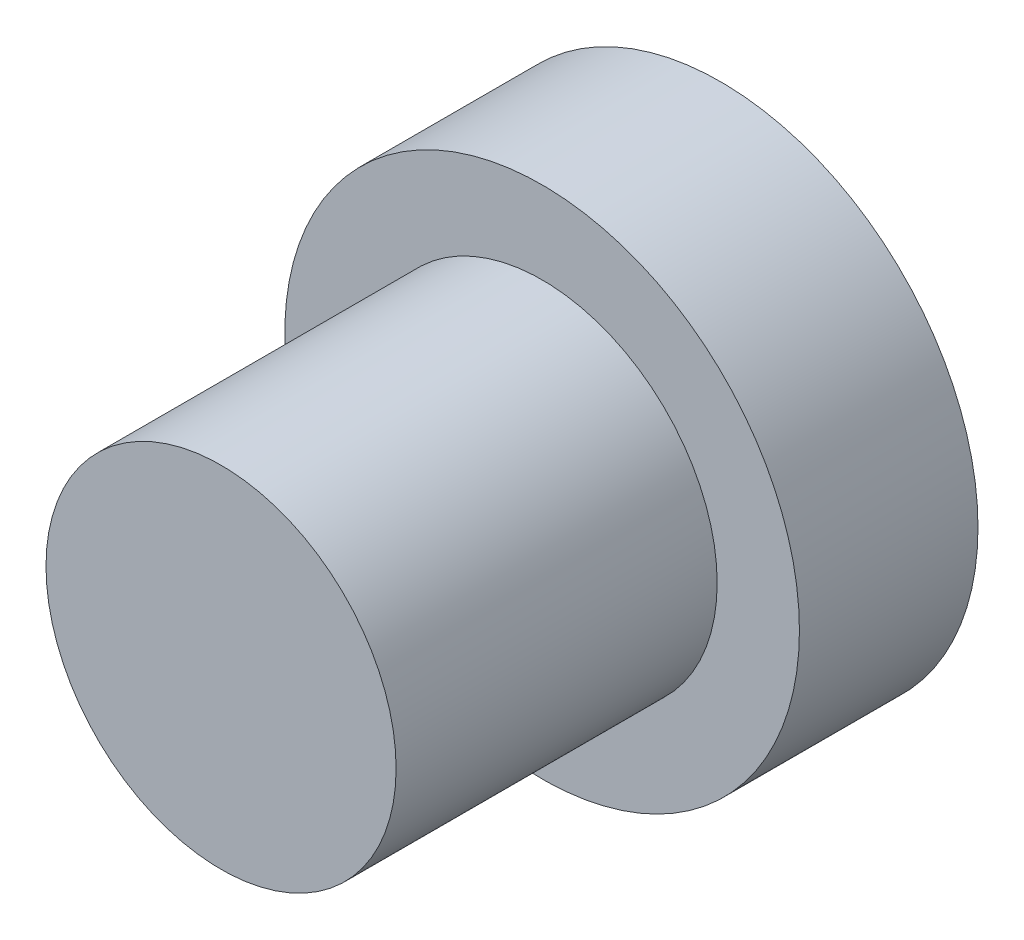
ISO-10303-21;
HEADER;
FILE_DESCRIPTION(('STEP AP214'),'2;1');
FILE_NAME('part.step','',(''),(''),'','','');
FILE_SCHEMA(('AUTOMOTIVE_DESIGN { 1 0 10303 214 1 1 1 1 }'));
ENDSEC;
DATA;
#1=APPLICATION_CONTEXT('core data for automotive mechanical design processes');
#2=APPLICATION_PROTOCOL_DEFINITION('international standard','automotive_design',2000,#1);
#3=PRODUCT_CONTEXT('',#1,'mechanical');
#4=PRODUCT('Part','Part','',(#3));
#5=PRODUCT_RELATED_PRODUCT_CATEGORY('part','',(#4));
#6=PRODUCT_DEFINITION_FORMATION('','',#4);
#7=PRODUCT_DEFINITION_CONTEXT('part definition',#1,'design');
#8=PRODUCT_DEFINITION('design','',#6,#7);
#9=PRODUCT_DEFINITION_SHAPE('','',#8);
#10=(LENGTH_UNIT() NAMED_UNIT(*) SI_UNIT(.MILLI.,.METRE.));
#11=(NAMED_UNIT(*) PLANE_ANGLE_UNIT() SI_UNIT($,.RADIAN.));
#12=(NAMED_UNIT(*) SI_UNIT($,.STERADIAN.) SOLID_ANGLE_UNIT());
#13=UNCERTAINTY_MEASURE_WITH_UNIT(LENGTH_MEASURE(1.E-05),#10,'distance_accuracy_value','');
#14=(GEOMETRIC_REPRESENTATION_CONTEXT(3) GLOBAL_UNCERTAINTY_ASSIGNED_CONTEXT((#13)) GLOBAL_UNIT_ASSIGNED_CONTEXT((#10,
#11,#12)) REPRESENTATION_CONTEXT('',''));
#15=CARTESIAN_POINT('',(0.,0.,0.));
#16=DIRECTION('',(0.,0.,1.));
#17=DIRECTION('',(1.,0.,0.));
#18=AXIS2_PLACEMENT_3D('',#15,#16,#17);
#19=CARTESIAN_POINT('',(0.,0.,5.1));
#20=DIRECTION('',(0.,0.,1.));
#21=DIRECTION('',(1.,0.,0.));
#22=AXIS2_PLACEMENT_3D('',#19,#20,#21);
#23=PLANE('',#22);
#24=CARTESIAN_POINT('',(0.,0.,5.1));
#25=DIRECTION('',(0.,0.,1.));
#26=DIRECTION('',(1.,0.,0.));
#27=AXIS2_PLACEMENT_3D('',#24,#25,#26);
#28=CIRCLE('',#27,7.35);
#29=CARTESIAN_POINT('',(7.35,0.,5.1));
#30=VERTEX_POINT('',#29);
#31=EDGE_CURVE('E10',#30,#30,#28,.T.);
#32=ORIENTED_EDGE('',*,*,#31,.T.);
#33=EDGE_LOOP('',(#32));
#34=FACE_BOUND('',#33,.T.);
#35=CARTESIAN_POINT('',(0.,0.,5.1));
#36=DIRECTION('',(0.,0.,1.));
#37=DIRECTION('',(1.,0.,0.));
#38=AXIS2_PLACEMENT_3D('',#35,#36,#37);
#39=CIRCLE('',#38,5.);
#40=CARTESIAN_POINT('',(5.,0.,5.1));
#41=VERTEX_POINT('',#40);
#42=EDGE_CURVE('E42',#41,#41,#39,.T.);
#43=ORIENTED_EDGE('',*,*,#42,.F.);
#44=EDGE_LOOP('',(#43));
#45=FACE_BOUND('',#44,.T.);
#46=ADVANCED_FACE('F29',(#34,#45),#23,.T.);
#47=CARTESIAN_POINT('',(0.,0.,5.1));
#48=DIRECTION('',(0.,0.,-1.));
#49=DIRECTION('',(-1.,0.,0.));
#50=AXIS2_PLACEMENT_3D('',#47,#48,#49);
#51=CYLINDRICAL_SURFACE('',#50,7.35);
#52=ORIENTED_EDGE('',*,*,#31,.F.);
#53=EDGE_LOOP('',(#52));
#54=FACE_BOUND('',#53,.T.);
#55=CARTESIAN_POINT('',(0.,0.,0.));
#56=DIRECTION('',(0.,0.,1.));
#57=DIRECTION('',(1.,0.,0.));
#58=AXIS2_PLACEMENT_3D('',#55,#56,#57);
#59=CIRCLE('',#58,7.35);
#60=CARTESIAN_POINT('',(7.35,0.,0.));
#61=VERTEX_POINT('',#60);
#62=EDGE_CURVE('E33',#61,#61,#59,.T.);
#63=ORIENTED_EDGE('',*,*,#62,.T.);
#64=EDGE_LOOP('',(#63));
#65=FACE_BOUND('',#64,.T.);
#66=ADVANCED_FACE('F31',(#54,#65),#51,.T.);
#67=CARTESIAN_POINT('',(0.,0.,0.));
#68=DIRECTION('',(0.,0.,1.));
#69=DIRECTION('',(1.,0.,0.));
#70=AXIS2_PLACEMENT_3D('',#67,#68,#69);
#71=PLANE('',#70);
#72=ORIENTED_EDGE('',*,*,#62,.F.);
#73=EDGE_LOOP('',(#72));
#74=FACE_BOUND('',#73,.T.);
#75=ADVANCED_FACE('F53',(#74),#71,.F.);
#76=CARTESIAN_POINT('',(0.,0.,14.27));
#77=DIRECTION('',(0.,0.,-1.));
#78=DIRECTION('',(-1.,0.,0.));
#79=AXIS2_PLACEMENT_3D('',#76,#77,#78);
#80=CYLINDRICAL_SURFACE('',#79,5.);
#81=CARTESIAN_POINT('',(0.,0.,14.27));
#82=DIRECTION('',(0.,0.,1.));
#83=DIRECTION('',(1.,0.,0.));
#84=AXIS2_PLACEMENT_3D('',#81,#82,#83);
#85=CIRCLE('',#84,5.);
#86=CARTESIAN_POINT('',(5.,0.,14.27));
#87=VERTEX_POINT('',#86);
#88=EDGE_CURVE('E40',#87,#87,#85,.T.);
#89=ORIENTED_EDGE('',*,*,#88,.F.);
#90=EDGE_LOOP('',(#89));
#91=FACE_BOUND('',#90,.T.);
#92=ORIENTED_EDGE('',*,*,#42,.T.);
#93=EDGE_LOOP('',(#92));
#94=FACE_BOUND('',#93,.T.);
#95=ADVANCED_FACE('F50',(#91,#94),#80,.T.);
#96=CARTESIAN_POINT('',(0.,0.,14.27));
#97=DIRECTION('',(0.,0.,1.));
#98=DIRECTION('',(1.,0.,0.));
#99=AXIS2_PLACEMENT_3D('',#96,#97,#98);
#100=PLANE('',#99);
#101=ORIENTED_EDGE('',*,*,#88,.T.);
#102=EDGE_LOOP('',(#101));
#103=FACE_BOUND('',#102,.T.);
#104=ADVANCED_FACE('F48',(#103),#100,.T.);
#105=CLOSED_SHELL('',(#46,#66,#75,#95,#104));
#106=MANIFOLD_SOLID_BREP('B2',#105);
#107=ADVANCED_BREP_SHAPE_REPRESENTATION('',(#18,#106),#14);
#108=SHAPE_DEFINITION_REPRESENTATION(#9,#107);
ENDSEC;
END-ISO-10303-21;
